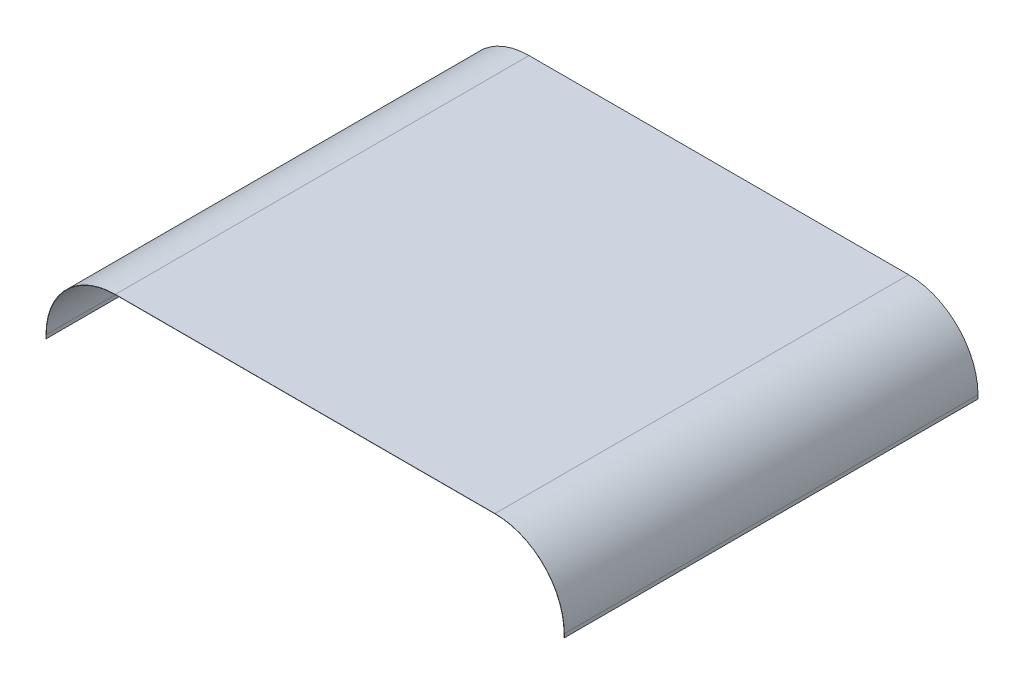
ISO-10303-21;
HEADER;
FILE_DESCRIPTION(('STEP AP214'),'2;1');
FILE_NAME('part.step','',(''),(''),'','','');
FILE_SCHEMA(('AUTOMOTIVE_DESIGN { 1 0 10303 214 1 1 1 1 }'));
ENDSEC;
DATA;
#1=APPLICATION_CONTEXT('core data for automotive mechanical design processes');
#2=APPLICATION_PROTOCOL_DEFINITION('international standard','automotive_design',2000,#1);
#3=PRODUCT_CONTEXT('',#1,'mechanical');
#4=PRODUCT('Part','Part','',(#3));
#5=PRODUCT_RELATED_PRODUCT_CATEGORY('part','',(#4));
#6=PRODUCT_DEFINITION_FORMATION('','',#4);
#7=PRODUCT_DEFINITION_CONTEXT('part definition',#1,'design');
#8=PRODUCT_DEFINITION('design','',#6,#7);
#9=PRODUCT_DEFINITION_SHAPE('','',#8);
#10=(LENGTH_UNIT() NAMED_UNIT(*) SI_UNIT(.MILLI.,.METRE.));
#11=(NAMED_UNIT(*) PLANE_ANGLE_UNIT() SI_UNIT($,.RADIAN.));
#12=(NAMED_UNIT(*) SI_UNIT($,.STERADIAN.) SOLID_ANGLE_UNIT());
#13=UNCERTAINTY_MEASURE_WITH_UNIT(LENGTH_MEASURE(1.E-05),#10,'distance_accuracy_value','');
#14=(GEOMETRIC_REPRESENTATION_CONTEXT(3) GLOBAL_UNCERTAINTY_ASSIGNED_CONTEXT((#13)) GLOBAL_UNIT_ASSIGNED_CONTEXT((#10,
#11,#12)) REPRESENTATION_CONTEXT('',''));
#15=CARTESIAN_POINT('',(0.,0.,0.));
#16=DIRECTION('',(0.,0.,1.));
#17=DIRECTION('',(1.,0.,0.));
#18=AXIS2_PLACEMENT_3D('',#15,#16,#17);
#19=CARTESIAN_POINT('',(2130.,0.,0.));
#20=DIRECTION('',(0.,0.,-1.));
#21=DIRECTION('',(0.,-1.,0.));
#22=AXIS2_PLACEMENT_3D('',#19,#20,#21);
#23=PLANE('',#22);
#24=DIRECTION('',(0.,1.,0.));
#25=VECTOR('',#24,1.);
#26=CARTESIAN_POINT('',(2129.,0.,0.));
#27=LINE('',#26,#25);
#28=CARTESIAN_POINT('',(2129.,0.,0.));
#29=VERTEX_POINT('',#28);
#30=CARTESIAN_POINT('',(2129.,-15.,0.));
#31=VERTEX_POINT('',#30);
#32=EDGE_CURVE('E195',#29,#31,#27,.F.);
#33=ORIENTED_EDGE('',*,*,#32,.F.);
#34=CARTESIAN_POINT('',(1845.,0.,0.));
#35=DIRECTION('',(0.,0.,1.));
#36=DIRECTION('',(1.,0.,0.));
#37=AXIS2_PLACEMENT_3D('',#34,#35,#36);
#38=CIRCLE('',#37,284.);
#39=CARTESIAN_POINT('',(1845.,284.,0.));
#40=VERTEX_POINT('',#39);
#41=EDGE_CURVE('E191',#40,#29,#38,.F.);
#42=ORIENTED_EDGE('',*,*,#41,.F.);
#43=DIRECTION('',(1.,0.,0.));
#44=VECTOR('',#43,1.);
#45=CARTESIAN_POINT('',(285.,284.,0.));
#46=LINE('',#45,#44);
#47=CARTESIAN_POINT('',(285.,284.,0.));
#48=VERTEX_POINT('',#47);
#49=EDGE_CURVE('E187',#48,#40,#46,.T.);
#50=ORIENTED_EDGE('',*,*,#49,.F.);
#51=CARTESIAN_POINT('',(285.,0.,0.));
#52=DIRECTION('',(0.,0.,1.));
#53=DIRECTION('',(1.,0.,0.));
#54=AXIS2_PLACEMENT_3D('',#51,#52,#53);
#55=CIRCLE('',#54,284.);
#56=CARTESIAN_POINT('',(1.,0.,0.));
#57=VERTEX_POINT('',#56);
#58=EDGE_CURVE('E184',#57,#48,#55,.F.);
#59=ORIENTED_EDGE('',*,*,#58,.F.);
#60=DIRECTION('',(0.,1.,0.));
#61=VECTOR('',#60,1.);
#62=CARTESIAN_POINT('',(1.,0.,0.));
#63=LINE('',#62,#61);
#64=CARTESIAN_POINT('',(1.,-15.,0.));
#65=VERTEX_POINT('',#64);
#66=EDGE_CURVE('E180',#65,#57,#63,.T.);
#67=ORIENTED_EDGE('',*,*,#66,.F.);
#68=DIRECTION('',(1.,0.,0.));
#69=VECTOR('',#68,1.);
#70=CARTESIAN_POINT('',(0.,-15.,0.));
#71=LINE('',#70,#69);
#72=CARTESIAN_POINT('',(0.,-15.,0.));
#73=VERTEX_POINT('',#72);
#74=EDGE_CURVE('E11',#73,#65,#71,.T.);
#75=ORIENTED_EDGE('',*,*,#74,.F.);
#76=DIRECTION('',(0.,1.,0.));
#77=VECTOR('',#76,1.);
#78=CARTESIAN_POINT('',(0.,0.,0.));
#79=LINE('',#78,#77);
#80=CARTESIAN_POINT('',(0.,0.,0.));
#81=VERTEX_POINT('',#80);
#82=EDGE_CURVE('E153',#73,#81,#79,.T.);
#83=ORIENTED_EDGE('',*,*,#82,.T.);
#84=CARTESIAN_POINT('',(285.,0.,0.));
#85=DIRECTION('',(0.,0.,-1.));
#86=DIRECTION('',(-1.,0.,0.));
#87=AXIS2_PLACEMENT_3D('',#84,#85,#86);
#88=CIRCLE('',#87,285.);
#89=CARTESIAN_POINT('',(285.,285.,0.));
#90=VERTEX_POINT('',#89);
#91=EDGE_CURVE('E155',#81,#90,#88,.T.);
#92=ORIENTED_EDGE('',*,*,#91,.T.);
#93=DIRECTION('',(1.,0.,0.));
#94=VECTOR('',#93,1.);
#95=CARTESIAN_POINT('',(285.,285.,0.));
#96=LINE('',#95,#94);
#97=CARTESIAN_POINT('',(1845.,285.,0.));
#98=VERTEX_POINT('',#97);
#99=EDGE_CURVE('E148',#90,#98,#96,.T.);
#100=ORIENTED_EDGE('',*,*,#99,.T.);
#101=CARTESIAN_POINT('',(1845.,0.,0.));
#102=DIRECTION('',(0.,0.,-1.));
#103=DIRECTION('',(1.,0.,0.));
#104=AXIS2_PLACEMENT_3D('',#101,#102,#103);
#105=CIRCLE('',#104,285.);
#106=CARTESIAN_POINT('',(2130.,0.,0.));
#107=VERTEX_POINT('',#106);
#108=EDGE_CURVE('E145',#98,#107,#105,.T.);
#109=ORIENTED_EDGE('',*,*,#108,.T.);
#110=DIRECTION('',(0.,-1.,0.));
#111=VECTOR('',#110,1.);
#112=CARTESIAN_POINT('',(2130.,0.,0.));
#113=LINE('',#112,#111);
#114=CARTESIAN_POINT('',(2130.,-15.,0.));
#115=VERTEX_POINT('',#114);
#116=EDGE_CURVE('E135',#107,#115,#113,.T.);
#117=ORIENTED_EDGE('',*,*,#116,.T.);
#118=DIRECTION('',(-1.,0.,0.));
#119=VECTOR('',#118,1.);
#120=CARTESIAN_POINT('',(2130.,-15.,0.));
#121=LINE('',#120,#119);
#122=EDGE_CURVE('E45',#115,#31,#121,.T.);
#123=ORIENTED_EDGE('',*,*,#122,.T.);
#124=EDGE_LOOP('',(#33,#42,#50,#59,#67,#75,#83,#92,#100,#109,#117,#123));
#125=FACE_BOUND('',#124,.T.);
#126=ADVANCED_FACE('F35',(#125),#23,.T.);
#127=CARTESIAN_POINT('',(2130.,-15.,0.));
#128=DIRECTION('',(0.,-1.,0.));
#129=DIRECTION('',(0.,0.,1.));
#130=AXIS2_PLACEMENT_3D('',#127,#128,#129);
#131=PLANE('',#130);
#132=ORIENTED_EDGE('',*,*,#122,.F.);
#133=DIRECTION('',(0.,0.,1.));
#134=VECTOR('',#133,1.);
#135=CARTESIAN_POINT('',(2130.,-15.,0.));
#136=LINE('',#135,#134);
#137=CARTESIAN_POINT('',(2130.,-15.,1700.));
#138=VERTEX_POINT('',#137);
#139=EDGE_CURVE('E131',#115,#138,#136,.T.);
#140=ORIENTED_EDGE('',*,*,#139,.T.);
#141=DIRECTION('',(-1.,0.,0.));
#142=VECTOR('',#141,1.);
#143=CARTESIAN_POINT('',(2130.,-15.,1700.));
#144=LINE('',#143,#142);
#145=CARTESIAN_POINT('',(2129.,-15.,1700.));
#146=VERTEX_POINT('',#145);
#147=EDGE_CURVE('E116',#138,#146,#144,.T.);
#148=ORIENTED_EDGE('',*,*,#147,.T.);
#149=DIRECTION('',(0.,0.,1.));
#150=VECTOR('',#149,1.);
#151=CARTESIAN_POINT('',(2129.,-15.,0.));
#152=LINE('',#151,#150);
#153=EDGE_CURVE('E197',#31,#146,#152,.T.);
#154=ORIENTED_EDGE('',*,*,#153,.F.);
#155=EDGE_LOOP('',(#132,#140,#148,#154));
#156=FACE_BOUND('',#155,.T.);
#157=ADVANCED_FACE('F133',(#156),#131,.T.);
#158=CARTESIAN_POINT('',(0.,0.,1700.));
#159=DIRECTION('',(0.,0.,-1.));
#160=DIRECTION('',(0.,1.,0.));
#161=AXIS2_PLACEMENT_3D('',#158,#159,#160);
#162=PLANE('',#161);
#163=DIRECTION('',(0.,1.,0.));
#164=VECTOR('',#163,1.);
#165=CARTESIAN_POINT('',(1.,0.,1700.));
#166=LINE('',#165,#164);
#167=CARTESIAN_POINT('',(1.,-15.,1700.));
#168=VERTEX_POINT('',#167);
#169=CARTESIAN_POINT('',(1.,0.,1700.));
#170=VERTEX_POINT('',#169);
#171=EDGE_CURVE('E181',#168,#170,#166,.T.);
#172=ORIENTED_EDGE('',*,*,#171,.T.);
#173=CARTESIAN_POINT('',(285.,0.,1700.));
#174=DIRECTION('',(0.,0.,1.));
#175=DIRECTION('',(1.,0.,0.));
#176=AXIS2_PLACEMENT_3D('',#173,#174,#175);
#177=CIRCLE('',#176,284.);
#178=CARTESIAN_POINT('',(285.,284.,1700.));
#179=VERTEX_POINT('',#178);
#180=EDGE_CURVE('E189',#170,#179,#177,.F.);
#181=ORIENTED_EDGE('',*,*,#180,.T.);
#182=DIRECTION('',(1.,0.,0.));
#183=VECTOR('',#182,1.);
#184=CARTESIAN_POINT('',(285.,284.,1700.));
#185=LINE('',#184,#183);
#186=CARTESIAN_POINT('',(1845.,284.,1700.));
#187=VERTEX_POINT('',#186);
#188=EDGE_CURVE('E193',#179,#187,#185,.T.);
#189=ORIENTED_EDGE('',*,*,#188,.T.);
#190=CARTESIAN_POINT('',(1845.,0.,1700.));
#191=DIRECTION('',(0.,0.,1.));
#192=DIRECTION('',(1.,0.,0.));
#193=AXIS2_PLACEMENT_3D('',#190,#191,#192);
#194=CIRCLE('',#193,284.);
#195=CARTESIAN_POINT('',(2129.,0.,1700.));
#196=VERTEX_POINT('',#195);
#197=EDGE_CURVE('E200',#187,#196,#194,.F.);
#198=ORIENTED_EDGE('',*,*,#197,.T.);
#199=DIRECTION('',(0.,1.,0.));
#200=VECTOR('',#199,1.);
#201=CARTESIAN_POINT('',(2129.,0.,1700.));
#202=LINE('',#201,#200);
#203=EDGE_CURVE('E123',#196,#146,#202,.F.);
#204=ORIENTED_EDGE('',*,*,#203,.T.);
#205=ORIENTED_EDGE('',*,*,#147,.F.);
#206=DIRECTION('',(0.,-1.,0.));
#207=VECTOR('',#206,1.);
#208=CARTESIAN_POINT('',(2130.,0.,1700.));
#209=LINE('',#208,#207);
#210=CARTESIAN_POINT('',(2130.,0.,1700.));
#211=VERTEX_POINT('',#210);
#212=EDGE_CURVE('E120',#211,#138,#209,.T.);
#213=ORIENTED_EDGE('',*,*,#212,.F.);
#214=CARTESIAN_POINT('',(1845.,0.,1700.));
#215=DIRECTION('',(0.,0.,-1.));
#216=DIRECTION('',(1.,0.,0.));
#217=AXIS2_PLACEMENT_3D('',#214,#215,#216);
#218=CIRCLE('',#217,285.);
#219=CARTESIAN_POINT('',(1845.,285.,1700.));
#220=VERTEX_POINT('',#219);
#221=EDGE_CURVE('E134',#220,#211,#218,.T.);
#222=ORIENTED_EDGE('',*,*,#221,.F.);
#223=DIRECTION('',(1.,0.,0.));
#224=VECTOR('',#223,1.);
#225=CARTESIAN_POINT('',(285.,285.,1700.));
#226=LINE('',#225,#224);
#227=CARTESIAN_POINT('',(285.,285.,1700.));
#228=VERTEX_POINT('',#227);
#229=EDGE_CURVE('E149',#228,#220,#226,.T.);
#230=ORIENTED_EDGE('',*,*,#229,.F.);
#231=CARTESIAN_POINT('',(285.,0.,1700.));
#232=DIRECTION('',(0.,0.,-1.));
#233=DIRECTION('',(-1.,0.,0.));
#234=AXIS2_PLACEMENT_3D('',#231,#232,#233);
#235=CIRCLE('',#234,285.);
#236=CARTESIAN_POINT('',(0.,0.,1700.));
#237=VERTEX_POINT('',#236);
#238=EDGE_CURVE('E156',#237,#228,#235,.T.);
#239=ORIENTED_EDGE('',*,*,#238,.F.);
#240=DIRECTION('',(0.,1.,0.));
#241=VECTOR('',#240,1.);
#242=CARTESIAN_POINT('',(0.,0.,1700.));
#243=LINE('',#242,#241);
#244=CARTESIAN_POINT('',(0.,-15.,1700.));
#245=VERTEX_POINT('',#244);
#246=EDGE_CURVE('E142',#245,#237,#243,.T.);
#247=ORIENTED_EDGE('',*,*,#246,.F.);
#248=DIRECTION('',(1.,0.,0.));
#249=VECTOR('',#248,1.);
#250=CARTESIAN_POINT('',(0.,-15.,1700.));
#251=LINE('',#250,#249);
#252=EDGE_CURVE('E39',#245,#168,#251,.T.);
#253=ORIENTED_EDGE('',*,*,#252,.T.);
#254=EDGE_LOOP('',(#172,#181,#189,#198,#204,#205,#213,#222,#230,#239,#247,#253));
#255=FACE_BOUND('',#254,.T.);
#256=ADVANCED_FACE('F118',(#255),#162,.F.);
#257=CARTESIAN_POINT('',(0.,-15.,0.));
#258=DIRECTION('',(0.,1.,0.));
#259=DIRECTION('',(0.,0.,1.));
#260=AXIS2_PLACEMENT_3D('',#257,#258,#259);
#261=PLANE('',#260);
#262=DIRECTION('',(0.,0.,1.));
#263=VECTOR('',#262,1.);
#264=CARTESIAN_POINT('',(0.,-15.,0.));
#265=LINE('',#264,#263);
#266=EDGE_CURVE('E150',#73,#245,#265,.T.);
#267=ORIENTED_EDGE('',*,*,#266,.F.);
#268=ORIENTED_EDGE('',*,*,#74,.T.);
#269=DIRECTION('',(0.,0.,1.));
#270=VECTOR('',#269,1.);
#271=CARTESIAN_POINT('',(1.,-15.,0.));
#272=LINE('',#271,#270);
#273=EDGE_CURVE('E177',#65,#168,#272,.T.);
#274=ORIENTED_EDGE('',*,*,#273,.T.);
#275=ORIENTED_EDGE('',*,*,#252,.F.);
#276=EDGE_LOOP('',(#267,#268,#274,#275));
#277=FACE_BOUND('',#276,.T.);
#278=ADVANCED_FACE('F37',(#277),#261,.F.);
#279=CARTESIAN_POINT('',(1.,0.,0.));
#280=DIRECTION('',(1.,0.,0.));
#281=DIRECTION('',(0.,1.,0.));
#282=AXIS2_PLACEMENT_3D('',#279,#280,#281);
#283=PLANE('',#282);
#284=ORIENTED_EDGE('',*,*,#171,.F.);
#285=ORIENTED_EDGE('',*,*,#273,.F.);
#286=ORIENTED_EDGE('',*,*,#66,.T.);
#287=DIRECTION('',(0.,0.,1.));
#288=VECTOR('',#287,1.);
#289=CARTESIAN_POINT('',(1.,0.,0.));
#290=LINE('',#289,#288);
#291=EDGE_CURVE('E186',#57,#170,#290,.T.);
#292=ORIENTED_EDGE('',*,*,#291,.T.);
#293=EDGE_LOOP('',(#284,#285,#286,#292));
#294=FACE_BOUND('',#293,.T.);
#295=ADVANCED_FACE('F218',(#294),#283,.T.);
#296=CARTESIAN_POINT('',(285.,0.,0.));
#297=DIRECTION('',(0.,0.,1.));
#298=DIRECTION('',(1.,0.,0.));
#299=AXIS2_PLACEMENT_3D('',#296,#297,#298);
#300=CYLINDRICAL_SURFACE('',#299,284.);
#301=ORIENTED_EDGE('',*,*,#180,.F.);
#302=ORIENTED_EDGE('',*,*,#291,.F.);
#303=ORIENTED_EDGE('',*,*,#58,.T.);
#304=DIRECTION('',(0.,0.,1.));
#305=VECTOR('',#304,1.);
#306=CARTESIAN_POINT('',(285.,284.,0.));
#307=LINE('',#306,#305);
#308=EDGE_CURVE('E190',#48,#179,#307,.T.);
#309=ORIENTED_EDGE('',*,*,#308,.T.);
#310=EDGE_LOOP('',(#301,#302,#303,#309));
#311=FACE_BOUND('',#310,.T.);
#312=ADVANCED_FACE('F224',(#311),#300,.F.);
#313=CARTESIAN_POINT('',(285.,284.,0.));
#314=DIRECTION('',(0.,-1.,0.));
#315=DIRECTION('',(0.,0.,-1.));
#316=AXIS2_PLACEMENT_3D('',#313,#314,#315);
#317=PLANE('',#316);
#318=ORIENTED_EDGE('',*,*,#188,.F.);
#319=ORIENTED_EDGE('',*,*,#308,.F.);
#320=ORIENTED_EDGE('',*,*,#49,.T.);
#321=DIRECTION('',(0.,0.,-1.));
#322=VECTOR('',#321,1.);
#323=CARTESIAN_POINT('',(1845.,284.,0.));
#324=LINE('',#323,#322);
#325=EDGE_CURVE('E194',#40,#187,#324,.F.);
#326=ORIENTED_EDGE('',*,*,#325,.T.);
#327=EDGE_LOOP('',(#318,#319,#320,#326));
#328=FACE_BOUND('',#327,.T.);
#329=ADVANCED_FACE('F238',(#328),#317,.T.);
#330=CARTESIAN_POINT('',(1845.,0.,0.));
#331=DIRECTION('',(0.,0.,1.));
#332=DIRECTION('',(1.,0.,0.));
#333=AXIS2_PLACEMENT_3D('',#330,#331,#332);
#334=CYLINDRICAL_SURFACE('',#333,284.);
#335=ORIENTED_EDGE('',*,*,#197,.F.);
#336=ORIENTED_EDGE('',*,*,#325,.F.);
#337=ORIENTED_EDGE('',*,*,#41,.T.);
#338=DIRECTION('',(0.,0.,1.));
#339=VECTOR('',#338,1.);
#340=CARTESIAN_POINT('',(2129.,0.,0.));
#341=LINE('',#340,#339);
#342=EDGE_CURVE('E198',#29,#196,#341,.T.);
#343=ORIENTED_EDGE('',*,*,#342,.T.);
#344=EDGE_LOOP('',(#335,#336,#337,#343));
#345=FACE_BOUND('',#344,.T.);
#346=ADVANCED_FACE('F248',(#345),#334,.F.);
#347=CARTESIAN_POINT('',(2129.,0.,0.));
#348=DIRECTION('',(-1.,0.,0.));
#349=DIRECTION('',(0.,0.,1.));
#350=AXIS2_PLACEMENT_3D('',#347,#348,#349);
#351=PLANE('',#350);
#352=ORIENTED_EDGE('',*,*,#203,.F.);
#353=ORIENTED_EDGE('',*,*,#342,.F.);
#354=ORIENTED_EDGE('',*,*,#32,.T.);
#355=ORIENTED_EDGE('',*,*,#153,.T.);
#356=EDGE_LOOP('',(#352,#353,#354,#355));
#357=FACE_BOUND('',#356,.T.);
#358=ADVANCED_FACE('F247',(#357),#351,.T.);
#359=CARTESIAN_POINT('',(0.,0.,0.));
#360=DIRECTION('',(1.,0.,0.));
#361=DIRECTION('',(0.,1.,0.));
#362=AXIS2_PLACEMENT_3D('',#359,#360,#361);
#363=PLANE('',#362);
#364=ORIENTED_EDGE('',*,*,#246,.T.);
#365=DIRECTION('',(0.,0.,1.));
#366=VECTOR('',#365,1.);
#367=CARTESIAN_POINT('',(0.,0.,0.));
#368=LINE('',#367,#366);
#369=EDGE_CURVE('E154',#81,#237,#368,.T.);
#370=ORIENTED_EDGE('',*,*,#369,.F.);
#371=ORIENTED_EDGE('',*,*,#82,.F.);
#372=ORIENTED_EDGE('',*,*,#266,.T.);
#373=EDGE_LOOP('',(#364,#370,#371,#372));
#374=FACE_BOUND('',#373,.T.);
#375=ADVANCED_FACE('F232',(#374),#363,.F.);
#376=CARTESIAN_POINT('',(285.,0.,0.));
#377=DIRECTION('',(0.,0.,1.));
#378=DIRECTION('',(1.,0.,0.));
#379=AXIS2_PLACEMENT_3D('',#376,#377,#378);
#380=CYLINDRICAL_SURFACE('',#379,285.);
#381=ORIENTED_EDGE('',*,*,#238,.T.);
#382=DIRECTION('',(0.,0.,1.));
#383=VECTOR('',#382,1.);
#384=CARTESIAN_POINT('',(285.,285.,0.));
#385=LINE('',#384,#383);
#386=EDGE_CURVE('E146',#90,#228,#385,.T.);
#387=ORIENTED_EDGE('',*,*,#386,.F.);
#388=ORIENTED_EDGE('',*,*,#91,.F.);
#389=ORIENTED_EDGE('',*,*,#369,.T.);
#390=EDGE_LOOP('',(#381,#387,#388,#389));
#391=FACE_BOUND('',#390,.T.);
#392=ADVANCED_FACE('F267',(#391),#380,.T.);
#393=CARTESIAN_POINT('',(285.,285.,0.));
#394=DIRECTION('',(0.,-1.,0.));
#395=DIRECTION('',(0.,0.,-1.));
#396=AXIS2_PLACEMENT_3D('',#393,#394,#395);
#397=PLANE('',#396);
#398=ORIENTED_EDGE('',*,*,#229,.T.);
#399=DIRECTION('',(0.,0.,1.));
#400=VECTOR('',#399,1.);
#401=CARTESIAN_POINT('',(1845.,285.,0.));
#402=LINE('',#401,#400);
#403=EDGE_CURVE('E137',#98,#220,#402,.T.);
#404=ORIENTED_EDGE('',*,*,#403,.F.);
#405=ORIENTED_EDGE('',*,*,#99,.F.);
#406=ORIENTED_EDGE('',*,*,#386,.T.);
#407=EDGE_LOOP('',(#398,#404,#405,#406));
#408=FACE_BOUND('',#407,.T.);
#409=ADVANCED_FACE('F270',(#408),#397,.F.);
#410=CARTESIAN_POINT('',(1845.,0.,0.));
#411=DIRECTION('',(0.,0.,1.));
#412=DIRECTION('',(1.,0.,0.));
#413=AXIS2_PLACEMENT_3D('',#410,#411,#412);
#414=CYLINDRICAL_SURFACE('',#413,285.);
#415=ORIENTED_EDGE('',*,*,#221,.T.);
#416=DIRECTION('',(0.,0.,1.));
#417=VECTOR('',#416,1.);
#418=CARTESIAN_POINT('',(2130.,0.,0.));
#419=LINE('',#418,#417);
#420=EDGE_CURVE('E109',#107,#211,#419,.T.);
#421=ORIENTED_EDGE('',*,*,#420,.F.);
#422=ORIENTED_EDGE('',*,*,#108,.F.);
#423=ORIENTED_EDGE('',*,*,#403,.T.);
#424=EDGE_LOOP('',(#415,#421,#422,#423));
#425=FACE_BOUND('',#424,.T.);
#426=ADVANCED_FACE('F273',(#425),#414,.T.);
#427=CARTESIAN_POINT('',(2130.,0.,0.));
#428=DIRECTION('',(-1.,0.,0.));
#429=DIRECTION('',(0.,0.,1.));
#430=AXIS2_PLACEMENT_3D('',#427,#428,#429);
#431=PLANE('',#430);
#432=ORIENTED_EDGE('',*,*,#212,.T.);
#433=ORIENTED_EDGE('',*,*,#139,.F.);
#434=ORIENTED_EDGE('',*,*,#116,.F.);
#435=ORIENTED_EDGE('',*,*,#420,.T.);
#436=EDGE_LOOP('',(#432,#433,#434,#435));
#437=FACE_BOUND('',#436,.T.);
#438=ADVANCED_FACE('F130',(#437),#431,.F.);
#439=CLOSED_SHELL('',(#126,#157,#256,#278,#295,#312,#329,#346,#358,#375,#392,#409,#426,#438));
#440=MANIFOLD_SOLID_BREP('B2',#439);
#441=ADVANCED_BREP_SHAPE_REPRESENTATION('',(#18,#440),#14);
#442=SHAPE_DEFINITION_REPRESENTATION(#9,#441);
ENDSEC;
END-ISO-10303-21;
